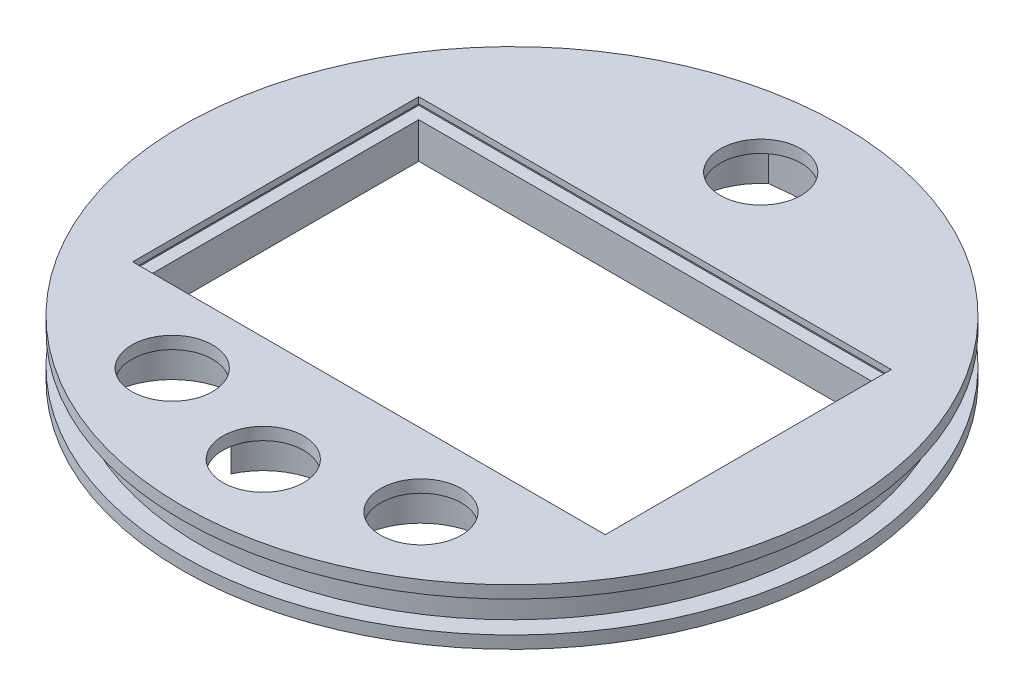
ISO-10303-21;
HEADER;
FILE_DESCRIPTION(('STEP AP214'),'2;1');
FILE_NAME('part.step','',(''),(''),'','','');
FILE_SCHEMA(('AUTOMOTIVE_DESIGN { 1 0 10303 214 1 1 1 1 }'));
ENDSEC;
DATA;
#1=APPLICATION_CONTEXT('core data for automotive mechanical design processes');
#2=APPLICATION_PROTOCOL_DEFINITION('international standard','automotive_design',2000,#1);
#3=PRODUCT_CONTEXT('',#1,'mechanical');
#4=PRODUCT('Part','Part','',(#3));
#5=PRODUCT_RELATED_PRODUCT_CATEGORY('part','',(#4));
#6=PRODUCT_DEFINITION_FORMATION('','',#4);
#7=PRODUCT_DEFINITION_CONTEXT('part definition',#1,'design');
#8=PRODUCT_DEFINITION('design','',#6,#7);
#9=PRODUCT_DEFINITION_SHAPE('','',#8);
#10=(LENGTH_UNIT() NAMED_UNIT(*) SI_UNIT(.MILLI.,.METRE.));
#11=(NAMED_UNIT(*) PLANE_ANGLE_UNIT() SI_UNIT($,.RADIAN.));
#12=(NAMED_UNIT(*) SI_UNIT($,.STERADIAN.) SOLID_ANGLE_UNIT());
#13=UNCERTAINTY_MEASURE_WITH_UNIT(LENGTH_MEASURE(1.E-05),#10,'distance_accuracy_value','');
#14=(GEOMETRIC_REPRESENTATION_CONTEXT(3) GLOBAL_UNCERTAINTY_ASSIGNED_CONTEXT((#13)) GLOBAL_UNIT_ASSIGNED_CONTEXT((#10,
#11,#12)) REPRESENTATION_CONTEXT('',''));
#15=CARTESIAN_POINT('',(0.,0.,0.));
#16=DIRECTION('',(0.,0.,1.));
#17=DIRECTION('',(1.,0.,0.));
#18=AXIS2_PLACEMENT_3D('',#15,#16,#17);
#19=CARTESIAN_POINT('',(38.,1.,0.));
#20=DIRECTION('',(-1.,0.,0.));
#21=DIRECTION('',(0.,0.,1.));
#22=AXIS2_PLACEMENT_3D('',#19,#20,#21);
#23=PLANE('',#22);
#24=DIRECTION('',(0.,-1.,0.));
#25=VECTOR('',#24,1.);
#26=CARTESIAN_POINT('',(38.,1.,-23.));
#27=LINE('',#26,#25);
#28=CARTESIAN_POINT('',(38.,1.,-23.));
#29=VERTEX_POINT('',#28);
#30=CARTESIAN_POINT('',(38.,0.,-23.));
#31=VERTEX_POINT('',#30);
#32=EDGE_CURVE('E422',#29,#31,#27,.T.);
#33=ORIENTED_EDGE('',*,*,#32,.T.);
#34=DIRECTION('',(0.,0.,1.));
#35=VECTOR('',#34,1.);
#36=CARTESIAN_POINT('',(38.,0.,0.));
#37=LINE('',#36,#35);
#38=CARTESIAN_POINT('',(38.,0.,23.));
#39=VERTEX_POINT('',#38);
#40=EDGE_CURVE('E56',#31,#39,#37,.T.);
#41=ORIENTED_EDGE('',*,*,#40,.T.);
#42=DIRECTION('',(0.,-1.,0.));
#43=VECTOR('',#42,1.);
#44=CARTESIAN_POINT('',(38.,1.,23.));
#45=LINE('',#44,#43);
#46=CARTESIAN_POINT('',(38.,1.,23.));
#47=VERTEX_POINT('',#46);
#48=EDGE_CURVE('E437',#47,#39,#45,.T.);
#49=ORIENTED_EDGE('',*,*,#48,.F.);
#50=DIRECTION('',(0.,0.,-1.));
#51=VECTOR('',#50,1.);
#52=CARTESIAN_POINT('',(38.,1.,0.));
#53=LINE('',#52,#51);
#54=EDGE_CURVE('E375',#47,#29,#53,.T.);
#55=ORIENTED_EDGE('',*,*,#54,.T.);
#56=EDGE_LOOP('',(#33,#41,#49,#55));
#57=FACE_BOUND('',#56,.T.);
#58=ADVANCED_FACE('F41',(#57),#23,.T.);
#59=CARTESIAN_POINT('',(0.,1.,23.));
#60=DIRECTION('',(0.,0.,-1.));
#61=DIRECTION('',(-1.,0.,0.));
#62=AXIS2_PLACEMENT_3D('',#59,#60,#61);
#63=PLANE('',#62);
#64=ORIENTED_EDGE('',*,*,#48,.T.);
#65=DIRECTION('',(-1.,0.,0.));
#66=VECTOR('',#65,1.);
#67=CARTESIAN_POINT('',(0.,0.,23.));
#68=LINE('',#67,#66);
#69=CARTESIAN_POINT('',(-38.,0.,23.));
#70=VERTEX_POINT('',#69);
#71=EDGE_CURVE('E277',#39,#70,#68,.T.);
#72=ORIENTED_EDGE('',*,*,#71,.T.);
#73=DIRECTION('',(0.,-1.,0.));
#74=VECTOR('',#73,1.);
#75=CARTESIAN_POINT('',(-38.,1.,23.));
#76=LINE('',#75,#74);
#77=CARTESIAN_POINT('',(-38.,1.,23.));
#78=VERTEX_POINT('',#77);
#79=EDGE_CURVE('E432',#78,#70,#76,.T.);
#80=ORIENTED_EDGE('',*,*,#79,.F.);
#81=DIRECTION('',(1.,0.,0.));
#82=VECTOR('',#81,1.);
#83=CARTESIAN_POINT('',(0.,1.,23.));
#84=LINE('',#83,#82);
#85=EDGE_CURVE('E379',#78,#47,#84,.T.);
#86=ORIENTED_EDGE('',*,*,#85,.T.);
#87=EDGE_LOOP('',(#64,#72,#80,#86));
#88=FACE_BOUND('',#87,.T.);
#89=ADVANCED_FACE('F533',(#88),#63,.T.);
#90=CARTESIAN_POINT('',(-38.,1.,0.));
#91=DIRECTION('',(-1.,0.,0.));
#92=DIRECTION('',(0.,0.,1.));
#93=AXIS2_PLACEMENT_3D('',#90,#91,#92);
#94=PLANE('',#93);
#95=DIRECTION('',(0.,0.,1.));
#96=VECTOR('',#95,1.);
#97=CARTESIAN_POINT('',(-38.,0.,0.));
#98=LINE('',#97,#96);
#99=CARTESIAN_POINT('',(-38.,0.,-23.));
#100=VERTEX_POINT('',#99);
#101=EDGE_CURVE('E274',#100,#70,#98,.T.);
#102=ORIENTED_EDGE('',*,*,#101,.F.);
#103=DIRECTION('',(0.,-1.,0.));
#104=VECTOR('',#103,1.);
#105=CARTESIAN_POINT('',(-38.,1.,-23.));
#106=LINE('',#105,#104);
#107=CARTESIAN_POINT('',(-38.,1.,-23.));
#108=VERTEX_POINT('',#107);
#109=EDGE_CURVE('E427',#108,#100,#106,.T.);
#110=ORIENTED_EDGE('',*,*,#109,.F.);
#111=DIRECTION('',(0.,0.,-1.));
#112=VECTOR('',#111,1.);
#113=CARTESIAN_POINT('',(-38.,1.,0.));
#114=LINE('',#113,#112);
#115=EDGE_CURVE('E384',#78,#108,#114,.T.);
#116=ORIENTED_EDGE('',*,*,#115,.F.);
#117=ORIENTED_EDGE('',*,*,#79,.T.);
#118=EDGE_LOOP('',(#102,#110,#116,#117));
#119=FACE_BOUND('',#118,.T.);
#120=ADVANCED_FACE('F538',(#119),#94,.F.);
#121=CARTESIAN_POINT('',(0.,1.,-23.));
#122=DIRECTION('',(0.,0.,-1.));
#123=DIRECTION('',(-1.,0.,0.));
#124=AXIS2_PLACEMENT_3D('',#121,#122,#123);
#125=PLANE('',#124);
#126=DIRECTION('',(-1.,0.,0.));
#127=VECTOR('',#126,1.);
#128=CARTESIAN_POINT('',(0.,0.,-23.));
#129=LINE('',#128,#127);
#130=EDGE_CURVE('E11',#31,#100,#129,.T.);
#131=ORIENTED_EDGE('',*,*,#130,.F.);
#132=ORIENTED_EDGE('',*,*,#32,.F.);
#133=DIRECTION('',(1.,0.,0.));
#134=VECTOR('',#133,1.);
#135=CARTESIAN_POINT('',(0.,1.,-23.));
#136=LINE('',#135,#134);
#137=EDGE_CURVE('E387',#108,#29,#136,.T.);
#138=ORIENTED_EDGE('',*,*,#137,.F.);
#139=ORIENTED_EDGE('',*,*,#109,.T.);
#140=EDGE_LOOP('',(#131,#132,#138,#139));
#141=FACE_BOUND('',#140,.T.);
#142=ADVANCED_FACE('F578',(#141),#125,.F.);
#143=CARTESIAN_POINT('',(0.,-1.,0.));
#144=DIRECTION('',(0.,1.,0.));
#145=DIRECTION('',(0.,0.,1.));
#146=AXIS2_PLACEMENT_3D('',#143,#144,#145);
#147=PLANE('',#146);
#148=CARTESIAN_POINT('',(19.9999999999999,-1.,34.6410161513776));
#149=DIRECTION('',(0.,1.,0.));
#150=DIRECTION('',(0.,0.,1.));
#151=AXIS2_PLACEMENT_3D('',#148,#149,#150);
#152=CIRCLE('',#151,6.5);
#153=CARTESIAN_POINT('',(19.9999999999999,-1.,41.1410161513776));
#154=VERTEX_POINT('',#153);
#155=EDGE_CURVE('E407',#154,#154,#152,.T.);
#156=ORIENTED_EDGE('',*,*,#155,.T.);
#157=EDGE_LOOP('',(#156));
#158=FACE_BOUND('',#157,.T.);
#159=CARTESIAN_POINT('',(-19.9999999999999,-1.,34.6410161513776));
#160=DIRECTION('',(0.,1.,0.));
#161=DIRECTION('',(0.,0.,1.));
#162=AXIS2_PLACEMENT_3D('',#159,#160,#161);
#163=CIRCLE('',#162,6.5);
#164=CARTESIAN_POINT('',(-19.9999999999999,-1.,41.1410161513776));
#165=VERTEX_POINT('',#164);
#166=EDGE_CURVE('E411',#165,#165,#163,.T.);
#167=ORIENTED_EDGE('',*,*,#166,.T.);
#168=EDGE_LOOP('',(#167));
#169=FACE_BOUND('',#168,.T.);
#170=CARTESIAN_POINT('',(0.,-1.,40.));
#171=DIRECTION('',(0.,1.,0.));
#172=DIRECTION('',(0.,0.,1.));
#173=AXIS2_PLACEMENT_3D('',#170,#171,#172);
#174=CIRCLE('',#173,6.5);
#175=CARTESIAN_POINT('',(0.,-1.,46.5));
#176=VERTEX_POINT('',#175);
#177=EDGE_CURVE('E415',#176,#176,#174,.T.);
#178=ORIENTED_EDGE('',*,*,#177,.T.);
#179=EDGE_LOOP('',(#178));
#180=FACE_BOUND('',#179,.T.);
#181=CARTESIAN_POINT('',(-19.9999999999999,-1.,34.6410161513776));
#182=DIRECTION('',(0.,1.,0.));
#183=DIRECTION('',(0.,0.,1.));
#184=AXIS2_PLACEMENT_3D('',#181,#182,#183);
#185=CIRCLE('',#184,10.5);
#186=CARTESIAN_POINT('',(-24.1594239467594,-1.,25.));
#187=VERTEX_POINT('',#186);
#188=CARTESIAN_POINT('',(-29.8765456384649,-1.,38.2052616888397));
#189=VERTEX_POINT('',#188);
#190=EDGE_CURVE('E321',#187,#189,#185,.T.);
#191=ORIENTED_EDGE('',*,*,#190,.F.);
#192=DIRECTION('',(1.,0.,0.));
#193=VECTOR('',#192,1.);
#194=CARTESIAN_POINT('',(0.,-1.,25.));
#195=LINE('',#194,#193);
#196=CARTESIAN_POINT('',(-15.8405760532404,-1.,25.));
#197=VERTEX_POINT('',#196);
#198=EDGE_CURVE('E261',#187,#197,#195,.T.);
#199=ORIENTED_EDGE('',*,*,#198,.T.);
#200=CARTESIAN_POINT('',(-9.5464885404603,-1.,35.627980266872));
#201=VERTEX_POINT('',#200);
#202=EDGE_CURVE('E322',#201,#197,#185,.T.);
#203=ORIENTED_EDGE('',*,*,#202,.F.);
#204=CARTESIAN_POINT('',(0.,-1.,40.));
#205=DIRECTION('',(0.,1.,0.));
#206=DIRECTION('',(0.,0.,1.));
#207=AXIS2_PLACEMENT_3D('',#204,#205,#206);
#208=CIRCLE('',#207,10.5);
#209=CARTESIAN_POINT('',(9.5464885404603,-1.,35.627980266872));
#210=VERTEX_POINT('',#209);
#211=EDGE_CURVE('E318',#210,#201,#208,.T.);
#212=ORIENTED_EDGE('',*,*,#211,.F.);
#213=CARTESIAN_POINT('',(19.9999999999999,-1.,34.6410161513776));
#214=DIRECTION('',(0.,1.,0.));
#215=DIRECTION('',(0.,0.,1.));
#216=AXIS2_PLACEMENT_3D('',#213,#214,#215);
#217=CIRCLE('',#216,10.5);
#218=CARTESIAN_POINT('',(15.8405760532404,-1.,25.));
#219=VERTEX_POINT('',#218);
#220=EDGE_CURVE('E299',#219,#210,#217,.T.);
#221=ORIENTED_EDGE('',*,*,#220,.F.);
#222=CARTESIAN_POINT('',(24.1594239467594,-1.,25.));
#223=VERTEX_POINT('',#222);
#224=EDGE_CURVE('E266',#219,#223,#195,.T.);
#225=ORIENTED_EDGE('',*,*,#224,.T.);
#226=CARTESIAN_POINT('',(29.8765456384649,-1.,38.2052616888397));
#227=VERTEX_POINT('',#226);
#228=EDGE_CURVE('E314',#227,#223,#217,.T.);
#229=ORIENTED_EDGE('',*,*,#228,.F.);
#230=CARTESIAN_POINT('',(0.,-1.,0.));
#231=DIRECTION('',(0.,-1.,0.));
#232=DIRECTION('',(0.,0.,-1.));
#233=AXIS2_PLACEMENT_3D('',#230,#231,#232);
#234=CIRCLE('',#233,48.5);
#235=EDGE_CURVE('E371',#227,#189,#234,.T.);
#236=ORIENTED_EDGE('',*,*,#235,.T.);
#237=EDGE_LOOP('',(#191,#199,#203,#212,#221,#225,#229,#236));
#238=FACE_BOUND('',#237,.T.);
#239=ADVANCED_FACE('F468',(#158,#169,#180,#238),#147,.F.);
#240=CARTESIAN_POINT('',(0.,-1.,-40.));
#241=DIRECTION('',(0.,1.,0.));
#242=DIRECTION('',(0.,0.,1.));
#243=AXIS2_PLACEMENT_3D('',#240,#241,#242);
#244=CIRCLE('',#243,6.5);
#245=CARTESIAN_POINT('',(0.,-1.,-33.5));
#246=VERTEX_POINT('',#245);
#247=EDGE_CURVE('E380',#246,#246,#244,.T.);
#248=ORIENTED_EDGE('',*,*,#247,.T.);
#249=EDGE_LOOP('',(#248));
#250=FACE_BOUND('',#249,.T.);
#251=CARTESIAN_POINT('',(0.,-1.,-40.));
#252=DIRECTION('',(0.,1.,0.));
#253=DIRECTION('',(0.,0.,1.));
#254=AXIS2_PLACEMENT_3D('',#251,#252,#253);
#255=CIRCLE('',#254,10.5);
#256=CARTESIAN_POINT('',(-6.771216655816,-1.,-48.025));
#257=VERTEX_POINT('',#256);
#258=CARTESIAN_POINT('',(6.77121665581602,-1.,-48.025));
#259=VERTEX_POINT('',#258);
#260=EDGE_CURVE('E304',#257,#259,#255,.T.);
#261=ORIENTED_EDGE('',*,*,#260,.F.);
#262=EDGE_CURVE('E362',#257,#259,#234,.T.);
#263=ORIENTED_EDGE('',*,*,#262,.T.);
#264=EDGE_LOOP('',(#261,#263));
#265=FACE_BOUND('',#264,.T.);
#266=ADVANCED_FACE('F637',(#250,#265),#147,.F.);
#267=CARTESIAN_POINT('',(0.,-8.,0.));
#268=DIRECTION('',(0.,1.,0.));
#269=DIRECTION('',(0.,0.,1.));
#270=AXIS2_PLACEMENT_3D('',#267,#268,#269);
#271=CYLINDRICAL_SURFACE('',#270,48.5);
#272=ORIENTED_EDGE('',*,*,#235,.F.);
#273=DIRECTION('',(0.,1.,0.));
#274=VECTOR('',#273,1.);
#275=CARTESIAN_POINT('',(29.8765456384649,-8.,38.2052616888397));
#276=LINE('',#275,#274);
#277=CARTESIAN_POINT('',(29.8765456384649,-8.,38.2052616888397));
#278=VERTEX_POINT('',#277);
#279=EDGE_CURVE('E346',#278,#227,#276,.T.);
#280=ORIENTED_EDGE('',*,*,#279,.F.);
#281=CARTESIAN_POINT('',(0.,-8.,0.));
#282=DIRECTION('',(0.,-1.,0.));
#283=DIRECTION('',(0.,0.,-1.));
#284=AXIS2_PLACEMENT_3D('',#281,#282,#283);
#285=CIRCLE('',#284,48.5);
#286=CARTESIAN_POINT('',(-29.8765456384649,-8.,38.2052616888397));
#287=VERTEX_POINT('',#286);
#288=EDGE_CURVE('E370',#278,#287,#285,.T.);
#289=ORIENTED_EDGE('',*,*,#288,.T.);
#290=DIRECTION('',(0.,1.,0.));
#291=VECTOR('',#290,1.);
#292=CARTESIAN_POINT('',(-29.8765456384649,-8.,38.2052616888397));
#293=LINE('',#292,#291);
#294=EDGE_CURVE('E334',#287,#189,#293,.T.);
#295=ORIENTED_EDGE('',*,*,#294,.T.);
#296=EDGE_LOOP('',(#272,#280,#289,#295));
#297=FACE_BOUND('',#296,.T.);
#298=ADVANCED_FACE('F496',(#297),#271,.F.);
#299=ORIENTED_EDGE('',*,*,#262,.F.);
#300=DIRECTION('',(0.,1.,0.));
#301=VECTOR('',#300,1.);
#302=CARTESIAN_POINT('',(-6.771216655816,-8.,-48.025));
#303=LINE('',#302,#301);
#304=CARTESIAN_POINT('',(-6.771216655816,-8.,-48.025));
#305=VERTEX_POINT('',#304);
#306=EDGE_CURVE('E331',#305,#257,#303,.T.);
#307=ORIENTED_EDGE('',*,*,#306,.F.);
#308=CARTESIAN_POINT('',(6.77121665581599,-8.,-48.025));
#309=VERTEX_POINT('',#308);
#310=EDGE_CURVE('E366',#305,#309,#285,.T.);
#311=ORIENTED_EDGE('',*,*,#310,.T.);
#312=DIRECTION('',(0.,1.,0.));
#313=VECTOR('',#312,1.);
#314=CARTESIAN_POINT('',(6.77121665581599,-8.,-48.025));
#315=LINE('',#314,#313);
#316=EDGE_CURVE('E313',#309,#259,#315,.T.);
#317=ORIENTED_EDGE('',*,*,#316,.T.);
#318=EDGE_LOOP('',(#299,#307,#311,#317));
#319=FACE_BOUND('',#318,.T.);
#320=ADVANCED_FACE('F546',(#319),#271,.F.);
#321=CARTESIAN_POINT('',(0.,1.,0.));
#322=DIRECTION('',(0.,-1.,0.));
#323=DIRECTION('',(0.,0.,-1.));
#324=AXIS2_PLACEMENT_3D('',#321,#322,#323);
#325=CYLINDRICAL_SURFACE('',#324,50.);
#326=CARTESIAN_POINT('',(0.,-1.,0.));
#327=DIRECTION('',(0.,1.,0.));
#328=DIRECTION('',(0.,0.,1.));
#329=AXIS2_PLACEMENT_3D('',#326,#327,#328);
#330=CIRCLE('',#329,50.);
#331=CARTESIAN_POINT('',(0.,-1.,50.));
#332=VERTEX_POINT('',#331);
#333=EDGE_CURVE('E441',#332,#332,#330,.T.);
#334=ORIENTED_EDGE('',*,*,#333,.F.);
#335=EDGE_LOOP('',(#334));
#336=FACE_BOUND('',#335,.T.);
#337=CARTESIAN_POINT('',(0.,-6.,0.));
#338=DIRECTION('',(0.,-1.,0.));
#339=DIRECTION('',(0.,0.,-1.));
#340=AXIS2_PLACEMENT_3D('',#337,#338,#339);
#341=CIRCLE('',#340,50.);
#342=CARTESIAN_POINT('',(0.,-6.,-50.));
#343=VERTEX_POINT('',#342);
#344=EDGE_CURVE('E445',#343,#343,#341,.T.);
#345=ORIENTED_EDGE('',*,*,#344,.F.);
#346=EDGE_LOOP('',(#345));
#347=FACE_BOUND('',#346,.T.);
#348=ADVANCED_FACE('F541',(#336,#347),#325,.T.);
#349=DIRECTION('',(0.,0.,1.));
#350=VECTOR('',#349,1.);
#351=CARTESIAN_POINT('',(38.,-2.2,0.));
#352=LINE('',#351,#350);
#353=CARTESIAN_POINT('',(38.,-2.2,-23.));
#354=VERTEX_POINT('',#353);
#355=CARTESIAN_POINT('',(38.,-2.2,23.));
#356=VERTEX_POINT('',#355);
#357=EDGE_CURVE('E258',#354,#356,#352,.T.);
#358=ORIENTED_EDGE('',*,*,#357,.F.);
#359=CARTESIAN_POINT('',(38.,-8.,-23.));
#360=VERTEX_POINT('',#359);
#361=EDGE_CURVE('E406',#354,#360,#27,.T.);
#362=ORIENTED_EDGE('',*,*,#361,.T.);
#363=DIRECTION('',(0.,0.,1.));
#364=VECTOR('',#363,1.);
#365=CARTESIAN_POINT('',(38.,-8.,23.));
#366=LINE('',#365,#364);
#367=CARTESIAN_POINT('',(38.,-8.,23.));
#368=VERTEX_POINT('',#367);
#369=EDGE_CURVE('E291',#360,#368,#366,.T.);
#370=ORIENTED_EDGE('',*,*,#369,.T.);
#371=EDGE_CURVE('E436',#356,#368,#45,.T.);
#372=ORIENTED_EDGE('',*,*,#371,.F.);
#373=EDGE_LOOP('',(#358,#362,#370,#372));
#374=FACE_BOUND('',#373,.T.);
#375=ADVANCED_FACE('F43',(#374),#23,.T.);
#376=DIRECTION('',(-1.,0.,0.));
#377=VECTOR('',#376,1.);
#378=CARTESIAN_POINT('',(0.,-2.2,23.));
#379=LINE('',#378,#377);
#380=CARTESIAN_POINT('',(-38.,-2.2,23.));
#381=VERTEX_POINT('',#380);
#382=EDGE_CURVE('E255',#356,#381,#379,.T.);
#383=ORIENTED_EDGE('',*,*,#382,.F.);
#384=ORIENTED_EDGE('',*,*,#371,.T.);
#385=DIRECTION('',(-1.,0.,0.));
#386=VECTOR('',#385,1.);
#387=CARTESIAN_POINT('',(-38.,-8.,23.));
#388=LINE('',#387,#386);
#389=CARTESIAN_POINT('',(-38.,-8.,23.));
#390=VERTEX_POINT('',#389);
#391=EDGE_CURVE('E295',#368,#390,#388,.T.);
#392=ORIENTED_EDGE('',*,*,#391,.T.);
#393=EDGE_CURVE('E431',#381,#390,#76,.T.);
#394=ORIENTED_EDGE('',*,*,#393,.F.);
#395=EDGE_LOOP('',(#383,#384,#392,#394));
#396=FACE_BOUND('',#395,.T.);
#397=ADVANCED_FACE('F506',(#396),#63,.T.);
#398=CARTESIAN_POINT('',(-38.,-2.2,-23.));
#399=VERTEX_POINT('',#398);
#400=CARTESIAN_POINT('',(-38.,-8.,-23.));
#401=VERTEX_POINT('',#400);
#402=EDGE_CURVE('E426',#399,#401,#106,.T.);
#403=ORIENTED_EDGE('',*,*,#402,.F.);
#404=DIRECTION('',(0.,0.,1.));
#405=VECTOR('',#404,1.);
#406=CARTESIAN_POINT('',(-38.,-2.2,0.));
#407=LINE('',#406,#405);
#408=EDGE_CURVE('E64',#399,#381,#407,.T.);
#409=ORIENTED_EDGE('',*,*,#408,.T.);
#410=ORIENTED_EDGE('',*,*,#393,.T.);
#411=DIRECTION('',(0.,0.,-1.));
#412=VECTOR('',#411,1.);
#413=CARTESIAN_POINT('',(-38.,-8.,23.));
#414=LINE('',#413,#412);
#415=EDGE_CURVE('E283',#390,#401,#414,.T.);
#416=ORIENTED_EDGE('',*,*,#415,.T.);
#417=EDGE_LOOP('',(#403,#409,#410,#416));
#418=FACE_BOUND('',#417,.T.);
#419=ADVANCED_FACE('F518',(#418),#94,.F.);
#420=CARTESIAN_POINT('',(0.,1.,-40.));
#421=DIRECTION('',(0.,-1.,0.));
#422=DIRECTION('',(0.,0.,-1.));
#423=AXIS2_PLACEMENT_3D('',#420,#421,#422);
#424=CYLINDRICAL_SURFACE('',#423,6.5);
#425=CARTESIAN_POINT('',(0.,1.,-40.));
#426=DIRECTION('',(0.,1.,0.));
#427=DIRECTION('',(0.,0.,1.));
#428=AXIS2_PLACEMENT_3D('',#425,#426,#427);
#429=CIRCLE('',#428,6.5);
#430=CARTESIAN_POINT('',(0.,1.,-33.5));
#431=VERTEX_POINT('',#430);
#432=EDGE_CURVE('E402',#431,#431,#429,.T.);
#433=ORIENTED_EDGE('',*,*,#432,.T.);
#434=EDGE_LOOP('',(#433));
#435=FACE_BOUND('',#434,.T.);
#436=ORIENTED_EDGE('',*,*,#247,.F.);
#437=EDGE_LOOP('',(#436));
#438=FACE_BOUND('',#437,.T.);
#439=ADVANCED_FACE('F559',(#435,#438),#424,.F.);
#440=CARTESIAN_POINT('',(0.,1.,40.));
#441=DIRECTION('',(0.,-1.,0.));
#442=DIRECTION('',(0.,0.,-1.));
#443=AXIS2_PLACEMENT_3D('',#440,#441,#442);
#444=CYLINDRICAL_SURFACE('',#443,6.5);
#445=CARTESIAN_POINT('',(0.,1.,40.));
#446=DIRECTION('',(0.,1.,0.));
#447=DIRECTION('',(0.,0.,1.));
#448=AXIS2_PLACEMENT_3D('',#445,#446,#447);
#449=CIRCLE('',#448,6.5);
#450=CARTESIAN_POINT('',(0.,1.,46.5));
#451=VERTEX_POINT('',#450);
#452=EDGE_CURVE('E398',#451,#451,#449,.T.);
#453=ORIENTED_EDGE('',*,*,#452,.T.);
#454=EDGE_LOOP('',(#453));
#455=FACE_BOUND('',#454,.T.);
#456=ORIENTED_EDGE('',*,*,#177,.F.);
#457=EDGE_LOOP('',(#456));
#458=FACE_BOUND('',#457,.T.);
#459=ADVANCED_FACE('F562',(#455,#458),#444,.F.);
#460=CARTESIAN_POINT('',(-19.9999999999999,1.,34.6410161513776));
#461=DIRECTION('',(0.,-1.,0.));
#462=DIRECTION('',(0.,0.,-1.));
#463=AXIS2_PLACEMENT_3D('',#460,#461,#462);
#464=CYLINDRICAL_SURFACE('',#463,6.5);
#465=CARTESIAN_POINT('',(-19.9999999999999,1.,34.6410161513776));
#466=DIRECTION('',(0.,1.,0.));
#467=DIRECTION('',(0.,0.,1.));
#468=AXIS2_PLACEMENT_3D('',#465,#466,#467);
#469=CIRCLE('',#468,6.5);
#470=CARTESIAN_POINT('',(-19.9999999999999,1.,41.1410161513776));
#471=VERTEX_POINT('',#470);
#472=EDGE_CURVE('E394',#471,#471,#469,.T.);
#473=ORIENTED_EDGE('',*,*,#472,.T.);
#474=EDGE_LOOP('',(#473));
#475=FACE_BOUND('',#474,.T.);
#476=ORIENTED_EDGE('',*,*,#166,.F.);
#477=EDGE_LOOP('',(#476));
#478=FACE_BOUND('',#477,.T.);
#479=ADVANCED_FACE('F566',(#475,#478),#464,.F.);
#480=CARTESIAN_POINT('',(19.9999999999999,1.,34.6410161513776));
#481=DIRECTION('',(0.,-1.,0.));
#482=DIRECTION('',(0.,0.,-1.));
#483=AXIS2_PLACEMENT_3D('',#480,#481,#482);
#484=CYLINDRICAL_SURFACE('',#483,6.5);
#485=CARTESIAN_POINT('',(19.9999999999999,1.,34.6410161513776));
#486=DIRECTION('',(0.,1.,0.));
#487=DIRECTION('',(0.,0.,1.));
#488=AXIS2_PLACEMENT_3D('',#485,#486,#487);
#489=CIRCLE('',#488,6.5);
#490=CARTESIAN_POINT('',(19.9999999999999,1.,41.1410161513776));
#491=VERTEX_POINT('',#490);
#492=EDGE_CURVE('E390',#491,#491,#489,.T.);
#493=ORIENTED_EDGE('',*,*,#492,.T.);
#494=EDGE_LOOP('',(#493));
#495=FACE_BOUND('',#494,.T.);
#496=ORIENTED_EDGE('',*,*,#155,.F.);
#497=EDGE_LOOP('',(#496));
#498=FACE_BOUND('',#497,.T.);
#499=ADVANCED_FACE('F570',(#495,#498),#484,.F.);
#500=ORIENTED_EDGE('',*,*,#361,.F.);
#501=DIRECTION('',(-1.,0.,0.));
#502=VECTOR('',#501,1.);
#503=CARTESIAN_POINT('',(0.,-2.2,-23.));
#504=LINE('',#503,#502);
#505=EDGE_CURVE('E250',#354,#399,#504,.T.);
#506=ORIENTED_EDGE('',*,*,#505,.T.);
#507=ORIENTED_EDGE('',*,*,#402,.T.);
#508=DIRECTION('',(1.,0.,0.));
#509=VECTOR('',#508,1.);
#510=CARTESIAN_POINT('',(-38.,-8.,-23.));
#511=LINE('',#510,#509);
#512=EDGE_CURVE('E287',#401,#360,#511,.T.);
#513=ORIENTED_EDGE('',*,*,#512,.T.);
#514=EDGE_LOOP('',(#500,#506,#507,#513));
#515=FACE_BOUND('',#514,.T.);
#516=ADVANCED_FACE('F520',(#515),#125,.F.);
#517=CARTESIAN_POINT('',(0.,1.,0.));
#518=DIRECTION('',(0.,1.,0.));
#519=DIRECTION('',(0.,0.,1.));
#520=AXIS2_PLACEMENT_3D('',#517,#518,#519);
#521=PLANE('',#520);
#522=ORIENTED_EDGE('',*,*,#54,.F.);
#523=ORIENTED_EDGE('',*,*,#85,.F.);
#524=ORIENTED_EDGE('',*,*,#115,.T.);
#525=ORIENTED_EDGE('',*,*,#137,.T.);
#526=EDGE_LOOP('',(#522,#523,#524,#525));
#527=FACE_BOUND('',#526,.T.);
#528=ORIENTED_EDGE('',*,*,#492,.F.);
#529=EDGE_LOOP('',(#528));
#530=FACE_BOUND('',#529,.T.);
#531=ORIENTED_EDGE('',*,*,#472,.F.);
#532=EDGE_LOOP('',(#531));
#533=FACE_BOUND('',#532,.T.);
#534=ORIENTED_EDGE('',*,*,#452,.F.);
#535=EDGE_LOOP('',(#534));
#536=FACE_BOUND('',#535,.T.);
#537=ORIENTED_EDGE('',*,*,#432,.F.);
#538=EDGE_LOOP('',(#537));
#539=FACE_BOUND('',#538,.T.);
#540=CARTESIAN_POINT('',(0.,1.,0.));
#541=DIRECTION('',(0.,1.,0.));
#542=DIRECTION('',(0.,0.,1.));
#543=AXIS2_PLACEMENT_3D('',#540,#541,#542);
#544=CIRCLE('',#543,53.);
#545=CARTESIAN_POINT('',(0.,1.,53.));
#546=VERTEX_POINT('',#545);
#547=EDGE_CURVE('E354',#546,#546,#544,.T.);
#548=ORIENTED_EDGE('',*,*,#547,.T.);
#549=EDGE_LOOP('',(#548));
#550=FACE_BOUND('',#549,.T.);
#551=ADVANCED_FACE('F577',(#527,#530,#533,#536,#539,#550),#521,.T.);
#552=CARTESIAN_POINT('',(0.,-8.,0.));
#553=DIRECTION('',(0.,-1.,0.));
#554=DIRECTION('',(0.,0.,-1.));
#555=AXIS2_PLACEMENT_3D('',#552,#553,#554);
#556=PLANE('',#555);
#557=ORIENTED_EDGE('',*,*,#288,.F.);
#558=CARTESIAN_POINT('',(19.9999999999999,-8.,34.6410161513776));
#559=DIRECTION('',(0.,1.,0.));
#560=DIRECTION('',(0.,0.,1.));
#561=AXIS2_PLACEMENT_3D('',#558,#559,#560);
#562=CIRCLE('',#561,10.5);
#563=CARTESIAN_POINT('',(9.5464885404603,-8.,35.627980266872));
#564=VERTEX_POINT('',#563);
#565=EDGE_CURVE('E300',#278,#564,#562,.T.);
#566=ORIENTED_EDGE('',*,*,#565,.T.);
#567=CARTESIAN_POINT('',(0.,-8.,40.));
#568=DIRECTION('',(0.,1.,0.));
#569=DIRECTION('',(0.,0.,1.));
#570=AXIS2_PLACEMENT_3D('',#567,#568,#569);
#571=CIRCLE('',#570,10.5);
#572=CARTESIAN_POINT('',(-9.5464885404603,-8.,35.627980266872));
#573=VERTEX_POINT('',#572);
#574=EDGE_CURVE('E303',#564,#573,#571,.T.);
#575=ORIENTED_EDGE('',*,*,#574,.T.);
#576=CARTESIAN_POINT('',(-19.9999999999999,-8.,34.6410161513776));
#577=DIRECTION('',(0.,1.,0.));
#578=DIRECTION('',(0.,0.,1.));
#579=AXIS2_PLACEMENT_3D('',#576,#577,#578);
#580=CIRCLE('',#579,10.5);
#581=EDGE_CURVE('E307',#573,#287,#580,.T.);
#582=ORIENTED_EDGE('',*,*,#581,.T.);
#583=EDGE_LOOP('',(#557,#566,#575,#582));
#584=FACE_BOUND('',#583,.T.);
#585=CARTESIAN_POINT('',(0.,-8.,-40.));
#586=DIRECTION('',(0.,1.,0.));
#587=DIRECTION('',(0.,0.,1.));
#588=AXIS2_PLACEMENT_3D('',#585,#586,#587);
#589=CIRCLE('',#588,10.5);
#590=EDGE_CURVE('E310',#305,#309,#589,.T.);
#591=ORIENTED_EDGE('',*,*,#590,.T.);
#592=ORIENTED_EDGE('',*,*,#310,.F.);
#593=EDGE_LOOP('',(#591,#592));
#594=FACE_BOUND('',#593,.T.);
#595=CARTESIAN_POINT('',(0.,-8.,0.));
#596=DIRECTION('',(0.,-1.,0.));
#597=DIRECTION('',(0.,0.,-1.));
#598=AXIS2_PLACEMENT_3D('',#595,#596,#597);
#599=CIRCLE('',#598,53.);
#600=CARTESIAN_POINT('',(0.,-8.,-53.));
#601=VERTEX_POINT('',#600);
#602=EDGE_CURVE('E349',#601,#601,#599,.T.);
#603=ORIENTED_EDGE('',*,*,#602,.T.);
#604=EDGE_LOOP('',(#603));
#605=FACE_BOUND('',#604,.T.);
#606=ORIENTED_EDGE('',*,*,#415,.F.);
#607=ORIENTED_EDGE('',*,*,#391,.F.);
#608=ORIENTED_EDGE('',*,*,#369,.F.);
#609=ORIENTED_EDGE('',*,*,#512,.F.);
#610=EDGE_LOOP('',(#606,#607,#608,#609));
#611=FACE_BOUND('',#610,.T.);
#612=ADVANCED_FACE('F491',(#584,#594,#605,#611),#556,.T.);
#613=CARTESIAN_POINT('',(0.,-1.,0.));
#614=DIRECTION('',(0.,1.,0.));
#615=DIRECTION('',(0.,0.,1.));
#616=AXIS2_PLACEMENT_3D('',#613,#614,#615);
#617=CYLINDRICAL_SURFACE('',#616,53.);
#618=CARTESIAN_POINT('',(0.,-1.,0.));
#619=DIRECTION('',(0.,1.,0.));
#620=DIRECTION('',(0.,0.,1.));
#621=AXIS2_PLACEMENT_3D('',#618,#619,#620);
#622=CIRCLE('',#621,53.);
#623=CARTESIAN_POINT('',(0.,-1.,53.));
#624=VERTEX_POINT('',#623);
#625=EDGE_CURVE('E358',#624,#624,#622,.T.);
#626=ORIENTED_EDGE('',*,*,#625,.T.);
#627=EDGE_LOOP('',(#626));
#628=FACE_BOUND('',#627,.T.);
#629=ORIENTED_EDGE('',*,*,#547,.F.);
#630=EDGE_LOOP('',(#629));
#631=FACE_BOUND('',#630,.T.);
#632=ADVANCED_FACE('F631',(#628,#631),#617,.T.);
#633=CARTESIAN_POINT('',(0.,-1.,0.));
#634=DIRECTION('',(0.,1.,0.));
#635=DIRECTION('',(0.,0.,1.));
#636=AXIS2_PLACEMENT_3D('',#633,#634,#635);
#637=PLANE('',#636);
#638=ORIENTED_EDGE('',*,*,#333,.T.);
#639=EDGE_LOOP('',(#638));
#640=FACE_BOUND('',#639,.T.);
#641=ORIENTED_EDGE('',*,*,#625,.F.);
#642=EDGE_LOOP('',(#641));
#643=FACE_BOUND('',#642,.T.);
#644=ADVANCED_FACE('F627',(#640,#643),#637,.F.);
#645=CARTESIAN_POINT('',(0.,-6.,0.));
#646=DIRECTION('',(0.,-1.,0.));
#647=DIRECTION('',(0.,0.,-1.));
#648=AXIS2_PLACEMENT_3D('',#645,#646,#647);
#649=CYLINDRICAL_SURFACE('',#648,53.);
#650=CARTESIAN_POINT('',(0.,-6.,0.));
#651=DIRECTION('',(0.,-1.,0.));
#652=DIRECTION('',(0.,0.,-1.));
#653=AXIS2_PLACEMENT_3D('',#650,#651,#652);
#654=CIRCLE('',#653,53.);
#655=CARTESIAN_POINT('',(0.,-6.,-53.));
#656=VERTEX_POINT('',#655);
#657=EDGE_CURVE('E350',#656,#656,#654,.T.);
#658=ORIENTED_EDGE('',*,*,#657,.T.);
#659=EDGE_LOOP('',(#658));
#660=FACE_BOUND('',#659,.T.);
#661=ORIENTED_EDGE('',*,*,#602,.F.);
#662=EDGE_LOOP('',(#661));
#663=FACE_BOUND('',#662,.T.);
#664=ADVANCED_FACE('F623',(#660,#663),#649,.T.);
#665=CARTESIAN_POINT('',(0.,-6.,0.));
#666=DIRECTION('',(0.,-1.,0.));
#667=DIRECTION('',(0.,0.,-1.));
#668=AXIS2_PLACEMENT_3D('',#665,#666,#667);
#669=PLANE('',#668);
#670=ORIENTED_EDGE('',*,*,#344,.T.);
#671=EDGE_LOOP('',(#670));
#672=FACE_BOUND('',#671,.T.);
#673=ORIENTED_EDGE('',*,*,#657,.F.);
#674=EDGE_LOOP('',(#673));
#675=FACE_BOUND('',#674,.T.);
#676=ADVANCED_FACE('F620',(#672,#675),#669,.F.);
#677=CARTESIAN_POINT('',(19.9999999999999,-8.,34.6410161513776));
#678=DIRECTION('',(0.,1.,0.));
#679=DIRECTION('',(0.,0.,1.));
#680=AXIS2_PLACEMENT_3D('',#677,#678,#679);
#681=CYLINDRICAL_SURFACE('',#680,10.5);
#682=ORIENTED_EDGE('',*,*,#228,.T.);
#683=DIRECTION('',(0.,1.,0.));
#684=VECTOR('',#683,1.);
#685=CARTESIAN_POINT('',(24.1594239467594,-8.,25.));
#686=LINE('',#685,#684);
#687=CARTESIAN_POINT('',(24.1594239467594,-2.2,25.));
#688=VERTEX_POINT('',#687);
#689=EDGE_CURVE('E270',#223,#688,#686,.F.);
#690=ORIENTED_EDGE('',*,*,#689,.T.);
#691=CARTESIAN_POINT('',(19.9999999999999,-2.2,34.6410161513776));
#692=DIRECTION('',(0.,-1.,0.));
#693=DIRECTION('',(0.,0.,-1.));
#694=AXIS2_PLACEMENT_3D('',#691,#692,#693);
#695=CIRCLE('',#694,10.5);
#696=CARTESIAN_POINT('',(15.8405760532404,-2.2,25.));
#697=VERTEX_POINT('',#696);
#698=EDGE_CURVE('E241',#688,#697,#695,.F.);
#699=ORIENTED_EDGE('',*,*,#698,.T.);
#700=DIRECTION('',(0.,1.,0.));
#701=VECTOR('',#700,1.);
#702=CARTESIAN_POINT('',(15.8405760532404,-8.,25.));
#703=LINE('',#702,#701);
#704=EDGE_CURVE('E265',#697,#219,#703,.T.);
#705=ORIENTED_EDGE('',*,*,#704,.T.);
#706=ORIENTED_EDGE('',*,*,#220,.T.);
#707=DIRECTION('',(0.,1.,0.));
#708=VECTOR('',#707,1.);
#709=CARTESIAN_POINT('',(9.5464885404603,-8.,35.627980266872));
#710=LINE('',#709,#708);
#711=EDGE_CURVE('E342',#564,#210,#710,.T.);
#712=ORIENTED_EDGE('',*,*,#711,.F.);
#713=ORIENTED_EDGE('',*,*,#565,.F.);
#714=ORIENTED_EDGE('',*,*,#279,.T.);
#715=EDGE_LOOP('',(#682,#690,#699,#705,#706,#712,#713,#714));
#716=FACE_BOUND('',#715,.T.);
#717=ADVANCED_FACE('F482',(#716),#681,.F.);
#718=CARTESIAN_POINT('',(0.,-8.,40.));
#719=DIRECTION('',(0.,1.,0.));
#720=DIRECTION('',(0.,0.,1.));
#721=AXIS2_PLACEMENT_3D('',#718,#719,#720);
#722=CYLINDRICAL_SURFACE('',#721,10.5);
#723=ORIENTED_EDGE('',*,*,#211,.T.);
#724=DIRECTION('',(0.,1.,0.));
#725=VECTOR('',#724,1.);
#726=CARTESIAN_POINT('',(-9.5464885404603,-8.,35.627980266872));
#727=LINE('',#726,#725);
#728=EDGE_CURVE('E338',#573,#201,#727,.T.);
#729=ORIENTED_EDGE('',*,*,#728,.F.);
#730=ORIENTED_EDGE('',*,*,#574,.F.);
#731=ORIENTED_EDGE('',*,*,#711,.T.);
#732=EDGE_LOOP('',(#723,#729,#730,#731));
#733=FACE_BOUND('',#732,.T.);
#734=ADVANCED_FACE('F486',(#733),#722,.F.);
#735=CARTESIAN_POINT('',(-19.9999999999999,-8.,34.6410161513776));
#736=DIRECTION('',(0.,1.,0.));
#737=DIRECTION('',(0.,0.,1.));
#738=AXIS2_PLACEMENT_3D('',#735,#736,#737);
#739=CYLINDRICAL_SURFACE('',#738,10.5);
#740=ORIENTED_EDGE('',*,*,#202,.T.);
#741=DIRECTION('',(0.,1.,0.));
#742=VECTOR('',#741,1.);
#743=CARTESIAN_POINT('',(-15.8405760532404,-8.,25.));
#744=LINE('',#743,#742);
#745=CARTESIAN_POINT('',(-15.8405760532404,-2.2,25.));
#746=VERTEX_POINT('',#745);
#747=EDGE_CURVE('E50',#197,#746,#744,.F.);
#748=ORIENTED_EDGE('',*,*,#747,.T.);
#749=CARTESIAN_POINT('',(-19.9999999999999,-2.2,34.6410161513776));
#750=DIRECTION('',(0.,-1.,0.));
#751=DIRECTION('',(0.,0.,-1.));
#752=AXIS2_PLACEMENT_3D('',#749,#750,#751);
#753=CIRCLE('',#752,10.5);
#754=CARTESIAN_POINT('',(-24.1594239467594,-2.2,25.));
#755=VERTEX_POINT('',#754);
#756=EDGE_CURVE('E449',#746,#755,#753,.F.);
#757=ORIENTED_EDGE('',*,*,#756,.T.);
#758=DIRECTION('',(0.,1.,0.));
#759=VECTOR('',#758,1.);
#760=CARTESIAN_POINT('',(-24.1594239467594,-8.,25.));
#761=LINE('',#760,#759);
#762=EDGE_CURVE('E453',#755,#187,#761,.T.);
#763=ORIENTED_EDGE('',*,*,#762,.T.);
#764=ORIENTED_EDGE('',*,*,#190,.T.);
#765=ORIENTED_EDGE('',*,*,#294,.F.);
#766=ORIENTED_EDGE('',*,*,#581,.F.);
#767=ORIENTED_EDGE('',*,*,#728,.T.);
#768=EDGE_LOOP('',(#740,#748,#757,#763,#764,#765,#766,#767));
#769=FACE_BOUND('',#768,.T.);
#770=ADVANCED_FACE('F459',(#769),#739,.F.);
#771=CARTESIAN_POINT('',(0.,-8.,-40.));
#772=DIRECTION('',(0.,1.,0.));
#773=DIRECTION('',(0.,0.,1.));
#774=AXIS2_PLACEMENT_3D('',#771,#772,#773);
#775=CYLINDRICAL_SURFACE('',#774,10.5);
#776=ORIENTED_EDGE('',*,*,#260,.T.);
#777=ORIENTED_EDGE('',*,*,#316,.F.);
#778=ORIENTED_EDGE('',*,*,#590,.F.);
#779=ORIENTED_EDGE('',*,*,#306,.T.);
#780=EDGE_LOOP('',(#776,#777,#778,#779));
#781=FACE_BOUND('',#780,.T.);
#782=ADVANCED_FACE('F529',(#781),#775,.F.);
#783=CARTESIAN_POINT('',(-40.,-2.2,25.));
#784=DIRECTION('',(0.,0.,1.));
#785=DIRECTION('',(1.,0.,0.));
#786=AXIS2_PLACEMENT_3D('',#783,#784,#785);
#787=PLANE('',#786);
#788=ORIENTED_EDGE('',*,*,#224,.F.);
#789=ORIENTED_EDGE('',*,*,#704,.F.);
#790=DIRECTION('',(1.,0.,0.));
#791=VECTOR('',#790,1.);
#792=CARTESIAN_POINT('',(-40.,-2.2,25.));
#793=LINE('',#792,#791);
#794=EDGE_CURVE('E229',#746,#697,#793,.T.);
#795=ORIENTED_EDGE('',*,*,#794,.F.);
#796=ORIENTED_EDGE('',*,*,#747,.F.);
#797=ORIENTED_EDGE('',*,*,#198,.F.);
#798=ORIENTED_EDGE('',*,*,#762,.F.);
#799=CARTESIAN_POINT('',(-40.,-2.2,25.));
#800=VERTEX_POINT('',#799);
#801=EDGE_CURVE('E202',#800,#755,#793,.T.);
#802=ORIENTED_EDGE('',*,*,#801,.F.);
#803=DIRECTION('',(0.,1.,0.));
#804=VECTOR('',#803,1.);
#805=CARTESIAN_POINT('',(-40.,-2.2,25.));
#806=LINE('',#805,#804);
#807=CARTESIAN_POINT('',(-40.,0.,25.));
#808=VERTEX_POINT('',#807);
#809=EDGE_CURVE('E242',#800,#808,#806,.T.);
#810=ORIENTED_EDGE('',*,*,#809,.T.);
#811=DIRECTION('',(1.,0.,0.));
#812=VECTOR('',#811,1.);
#813=CARTESIAN_POINT('',(-40.,0.,25.));
#814=LINE('',#813,#812);
#815=CARTESIAN_POINT('',(40.,0.,25.));
#816=VERTEX_POINT('',#815);
#817=EDGE_CURVE('E218',#808,#816,#814,.T.);
#818=ORIENTED_EDGE('',*,*,#817,.T.);
#819=DIRECTION('',(0.,1.,0.));
#820=VECTOR('',#819,1.);
#821=CARTESIAN_POINT('',(40.,-2.2,25.));
#822=LINE('',#821,#820);
#823=CARTESIAN_POINT('',(40.,-2.2,25.));
#824=VERTEX_POINT('',#823);
#825=EDGE_CURVE('E238',#824,#816,#822,.T.);
#826=ORIENTED_EDGE('',*,*,#825,.F.);
#827=EDGE_CURVE('E215',#688,#824,#793,.T.);
#828=ORIENTED_EDGE('',*,*,#827,.F.);
#829=ORIENTED_EDGE('',*,*,#689,.F.);
#830=EDGE_LOOP('',(#788,#789,#795,#796,#797,#798,#802,#810,#818,#826,#828,#829));
#831=FACE_BOUND('',#830,.T.);
#832=ADVANCED_FACE('F463',(#831),#787,.F.);
#833=CARTESIAN_POINT('',(0.,-2.2,0.));
#834=DIRECTION('',(0.,-1.,0.));
#835=DIRECTION('',(0.,0.,-1.));
#836=AXIS2_PLACEMENT_3D('',#833,#834,#835);
#837=PLANE('',#836);
#838=ORIENTED_EDGE('',*,*,#357,.T.);
#839=ORIENTED_EDGE('',*,*,#382,.T.);
#840=ORIENTED_EDGE('',*,*,#408,.F.);
#841=ORIENTED_EDGE('',*,*,#505,.F.);
#842=EDGE_LOOP('',(#838,#839,#840,#841));
#843=FACE_BOUND('',#842,.T.);
#844=ORIENTED_EDGE('',*,*,#827,.T.);
#845=DIRECTION('',(0.,0.,-1.));
#846=VECTOR('',#845,1.);
#847=CARTESIAN_POINT('',(40.,-2.2,25.));
#848=LINE('',#847,#846);
#849=CARTESIAN_POINT('',(40.,-2.2,-25.));
#850=VERTEX_POINT('',#849);
#851=EDGE_CURVE('E194',#824,#850,#848,.T.);
#852=ORIENTED_EDGE('',*,*,#851,.T.);
#853=DIRECTION('',(-1.,0.,0.));
#854=VECTOR('',#853,1.);
#855=CARTESIAN_POINT('',(-40.,-2.2,-25.));
#856=LINE('',#855,#854);
#857=CARTESIAN_POINT('',(-40.,-2.2,-25.));
#858=VERTEX_POINT('',#857);
#859=EDGE_CURVE('E205',#850,#858,#856,.T.);
#860=ORIENTED_EDGE('',*,*,#859,.T.);
#861=DIRECTION('',(0.,0.,1.));
#862=VECTOR('',#861,1.);
#863=CARTESIAN_POINT('',(-40.,-2.2,25.));
#864=LINE('',#863,#862);
#865=EDGE_CURVE('E211',#858,#800,#864,.T.);
#866=ORIENTED_EDGE('',*,*,#865,.T.);
#867=ORIENTED_EDGE('',*,*,#801,.T.);
#868=ORIENTED_EDGE('',*,*,#756,.F.);
#869=ORIENTED_EDGE('',*,*,#794,.T.);
#870=ORIENTED_EDGE('',*,*,#698,.F.);
#871=EDGE_LOOP('',(#844,#852,#860,#866,#867,#868,#869,#870));
#872=FACE_BOUND('',#871,.T.);
#873=ADVANCED_FACE('F213',(#843,#872),#837,.F.);
#874=CARTESIAN_POINT('',(40.,-2.2,25.));
#875=DIRECTION('',(1.,0.,0.));
#876=DIRECTION('',(0.,0.,-1.));
#877=AXIS2_PLACEMENT_3D('',#874,#875,#876);
#878=PLANE('',#877);
#879=DIRECTION('',(0.,0.,-1.));
#880=VECTOR('',#879,1.);
#881=CARTESIAN_POINT('',(40.,0.,25.));
#882=LINE('',#881,#880);
#883=CARTESIAN_POINT('',(40.,0.,-25.));
#884=VERTEX_POINT('',#883);
#885=EDGE_CURVE('E196',#816,#884,#882,.T.);
#886=ORIENTED_EDGE('',*,*,#885,.T.);
#887=DIRECTION('',(0.,1.,0.));
#888=VECTOR('',#887,1.);
#889=CARTESIAN_POINT('',(40.,-2.2,-25.));
#890=LINE('',#889,#888);
#891=EDGE_CURVE('E190',#850,#884,#890,.T.);
#892=ORIENTED_EDGE('',*,*,#891,.F.);
#893=ORIENTED_EDGE('',*,*,#851,.F.);
#894=ORIENTED_EDGE('',*,*,#825,.T.);
#895=EDGE_LOOP('',(#886,#892,#893,#894));
#896=FACE_BOUND('',#895,.T.);
#897=ADVANCED_FACE('F192',(#896),#878,.F.);
#898=CARTESIAN_POINT('',(-40.,-2.2,25.));
#899=DIRECTION('',(-1.,0.,0.));
#900=DIRECTION('',(0.,0.,1.));
#901=AXIS2_PLACEMENT_3D('',#898,#899,#900);
#902=PLANE('',#901);
#903=DIRECTION('',(0.,0.,1.));
#904=VECTOR('',#903,1.);
#905=CARTESIAN_POINT('',(-40.,0.,25.));
#906=LINE('',#905,#904);
#907=CARTESIAN_POINT('',(-40.,0.,-25.));
#908=VERTEX_POINT('',#907);
#909=EDGE_CURVE('E222',#908,#808,#906,.T.);
#910=ORIENTED_EDGE('',*,*,#909,.T.);
#911=ORIENTED_EDGE('',*,*,#809,.F.);
#912=ORIENTED_EDGE('',*,*,#865,.F.);
#913=DIRECTION('',(0.,1.,0.));
#914=VECTOR('',#913,1.);
#915=CARTESIAN_POINT('',(-40.,-2.2,-25.));
#916=LINE('',#915,#914);
#917=EDGE_CURVE('E201',#858,#908,#916,.T.);
#918=ORIENTED_EDGE('',*,*,#917,.T.);
#919=EDGE_LOOP('',(#910,#911,#912,#918));
#920=FACE_BOUND('',#919,.T.);
#921=ADVANCED_FACE('F527',(#920),#902,.F.);
#922=CARTESIAN_POINT('',(-40.,-2.2,-25.));
#923=DIRECTION('',(0.,0.,-1.));
#924=DIRECTION('',(-1.,0.,0.));
#925=AXIS2_PLACEMENT_3D('',#922,#923,#924);
#926=PLANE('',#925);
#927=DIRECTION('',(-1.,0.,0.));
#928=VECTOR('',#927,1.);
#929=CARTESIAN_POINT('',(-40.,0.,-25.));
#930=LINE('',#929,#928);
#931=EDGE_CURVE('E232',#884,#908,#930,.T.);
#932=ORIENTED_EDGE('',*,*,#931,.T.);
#933=ORIENTED_EDGE('',*,*,#917,.F.);
#934=ORIENTED_EDGE('',*,*,#859,.F.);
#935=ORIENTED_EDGE('',*,*,#891,.T.);
#936=EDGE_LOOP('',(#932,#933,#934,#935));
#937=FACE_BOUND('',#936,.T.);
#938=ADVANCED_FACE('F206',(#937),#926,.F.);
#939=CARTESIAN_POINT('',(0.,0.,0.));
#940=DIRECTION('',(0.,-1.,0.));
#941=DIRECTION('',(0.,0.,-1.));
#942=AXIS2_PLACEMENT_3D('',#939,#940,#941);
#943=PLANE('',#942);
#944=ORIENTED_EDGE('',*,*,#130,.T.);
#945=ORIENTED_EDGE('',*,*,#101,.T.);
#946=ORIENTED_EDGE('',*,*,#71,.F.);
#947=ORIENTED_EDGE('',*,*,#40,.F.);
#948=EDGE_LOOP('',(#944,#945,#946,#947));
#949=FACE_BOUND('',#948,.T.);
#950=ORIENTED_EDGE('',*,*,#885,.F.);
#951=ORIENTED_EDGE('',*,*,#817,.F.);
#952=ORIENTED_EDGE('',*,*,#909,.F.);
#953=ORIENTED_EDGE('',*,*,#931,.F.);
#954=EDGE_LOOP('',(#950,#951,#952,#953));
#955=FACE_BOUND('',#954,.T.);
#956=ADVANCED_FACE('F597',(#949,#955),#943,.T.);
#957=CLOSED_SHELL('',(#58,#89,#120,#142,#239,#266,#298,#320,#348,#375,#397,#419,#439,#459,#479,
#499,#516,#551,#612,#632,#644,#664,#676,#717,#734,#770,#782,#832,#873,#897,#921,#938,#956));
#958=MANIFOLD_SOLID_BREP('B2',#957);
#959=ADVANCED_BREP_SHAPE_REPRESENTATION('',(#18,#958),#14);
#960=SHAPE_DEFINITION_REPRESENTATION(#9,#959);
ENDSEC;
END-ISO-10303-21;
